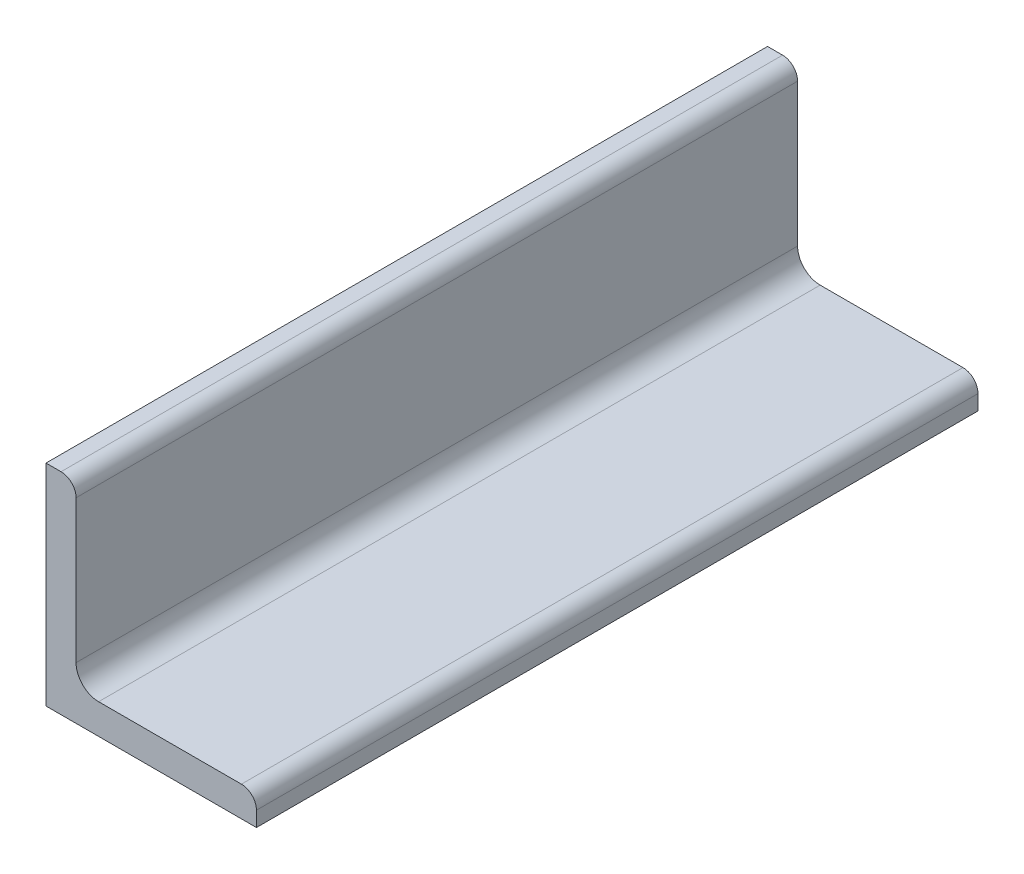
ISO-10303-21;
HEADER;
FILE_DESCRIPTION(('STEP AP214'),'2;1');
FILE_NAME('part.step','',(''),(''),'','','');
FILE_SCHEMA(('AUTOMOTIVE_DESIGN { 1 0 10303 214 1 1 1 1 }'));
ENDSEC;
DATA;
#1=APPLICATION_CONTEXT('core data for automotive mechanical design processes');
#2=APPLICATION_PROTOCOL_DEFINITION('international standard','automotive_design',2000,#1);
#3=PRODUCT_CONTEXT('',#1,'mechanical');
#4=PRODUCT('Part','Part','',(#3));
#5=PRODUCT_RELATED_PRODUCT_CATEGORY('part','',(#4));
#6=PRODUCT_DEFINITION_FORMATION('','',#4);
#7=PRODUCT_DEFINITION_CONTEXT('part definition',#1,'design');
#8=PRODUCT_DEFINITION('design','',#6,#7);
#9=PRODUCT_DEFINITION_SHAPE('','',#8);
#10=(LENGTH_UNIT() NAMED_UNIT(*) SI_UNIT(.MILLI.,.METRE.));
#11=(NAMED_UNIT(*) PLANE_ANGLE_UNIT() SI_UNIT($,.RADIAN.));
#12=(NAMED_UNIT(*) SI_UNIT($,.STERADIAN.) SOLID_ANGLE_UNIT());
#13=UNCERTAINTY_MEASURE_WITH_UNIT(LENGTH_MEASURE(1.E-05),#10,'distance_accuracy_value','');
#14=(GEOMETRIC_REPRESENTATION_CONTEXT(3) GLOBAL_UNCERTAINTY_ASSIGNED_CONTEXT((#13)) GLOBAL_UNIT_ASSIGNED_CONTEXT((#10,
#11,#12)) REPRESENTATION_CONTEXT('',''));
#15=CARTESIAN_POINT('',(0.,0.,0.));
#16=DIRECTION('',(0.,0.,1.));
#17=DIRECTION('',(1.,0.,0.));
#18=AXIS2_PLACEMENT_3D('',#15,#16,#17);
#19=CARTESIAN_POINT('',(0.0836264027816469,89.7372005393545,304.8));
#20=DIRECTION('',(1.,0.,0.));
#21=DIRECTION('',(0.,0.,-1.));
#22=AXIS2_PLACEMENT_3D('',#19,#20,#21);
#23=PLANE('',#22);
#24=DIRECTION('',(0.,-1.,0.));
#25=VECTOR('',#24,1.);
#26=CARTESIAN_POINT('',(0.0836264027816469,89.7372005393545,0.));
#27=LINE('',#26,#25);
#28=CARTESIAN_POINT('',(0.0836264027816469,89.7372005393545,0.));
#29=VERTEX_POINT('',#28);
#30=CARTESIAN_POINT('',(0.0836264027816469,0.837200539354535,0.));
#31=VERTEX_POINT('',#30);
#32=EDGE_CURVE('E135',#29,#31,#27,.T.);
#33=ORIENTED_EDGE('',*,*,#32,.T.);
#34=DIRECTION('',(0.,0.,-1.));
#35=VECTOR('',#34,1.);
#36=CARTESIAN_POINT('',(0.0836264027816469,0.837200539354535,304.8));
#37=LINE('',#36,#35);
#38=CARTESIAN_POINT('',(0.0836264027816469,0.837200539354535,304.8));
#39=VERTEX_POINT('',#38);
#40=EDGE_CURVE('E11',#39,#31,#37,.T.);
#41=ORIENTED_EDGE('',*,*,#40,.F.);
#42=DIRECTION('',(0.,-1.,0.));
#43=VECTOR('',#42,1.);
#44=CARTESIAN_POINT('',(0.0836264027816469,89.7372005393545,304.8));
#45=LINE('',#44,#43);
#46=CARTESIAN_POINT('',(0.0836264027816469,89.7372005393545,304.8));
#47=VERTEX_POINT('',#46);
#48=EDGE_CURVE('E151',#47,#39,#45,.T.);
#49=ORIENTED_EDGE('',*,*,#48,.F.);
#50=DIRECTION('',(0.,0.,-1.));
#51=VECTOR('',#50,1.);
#52=CARTESIAN_POINT('',(0.0836264027816469,89.7372005393545,304.8));
#53=LINE('',#52,#51);
#54=EDGE_CURVE('E131',#47,#29,#53,.T.);
#55=ORIENTED_EDGE('',*,*,#54,.T.);
#56=EDGE_LOOP('',(#33,#41,#49,#55));
#57=FACE_BOUND('',#56,.T.);
#58=ADVANCED_FACE('F33',(#57),#23,.F.);
#59=CARTESIAN_POINT('',(0.0836264027816469,0.837200539354535,304.8));
#60=DIRECTION('',(0.,1.,0.));
#61=DIRECTION('',(0.,0.,1.));
#62=AXIS2_PLACEMENT_3D('',#59,#60,#61);
#63=PLANE('',#62);
#64=DIRECTION('',(1.,0.,0.));
#65=VECTOR('',#64,1.);
#66=CARTESIAN_POINT('',(0.0836264027816469,0.837200539354535,0.));
#67=LINE('',#66,#65);
#68=CARTESIAN_POINT('',(88.9836264027817,0.837200539354535,0.));
#69=VERTEX_POINT('',#68);
#70=EDGE_CURVE('E138',#31,#69,#67,.T.);
#71=ORIENTED_EDGE('',*,*,#70,.T.);
#72=DIRECTION('',(0.,0.,-1.));
#73=VECTOR('',#72,1.);
#74=CARTESIAN_POINT('',(88.9836264027817,0.837200539354535,304.8));
#75=LINE('',#74,#73);
#76=CARTESIAN_POINT('',(88.9836264027817,0.837200539354535,304.8));
#77=VERTEX_POINT('',#76);
#78=EDGE_CURVE('E41',#77,#69,#75,.T.);
#79=ORIENTED_EDGE('',*,*,#78,.F.);
#80=DIRECTION('',(1.,0.,0.));
#81=VECTOR('',#80,1.);
#82=CARTESIAN_POINT('',(0.0836264027816469,0.837200539354535,304.8));
#83=LINE('',#82,#81);
#84=EDGE_CURVE('E95',#39,#77,#83,.T.);
#85=ORIENTED_EDGE('',*,*,#84,.F.);
#86=ORIENTED_EDGE('',*,*,#40,.T.);
#87=EDGE_LOOP('',(#71,#79,#85,#86));
#88=FACE_BOUND('',#87,.T.);
#89=ADVANCED_FACE('F194',(#88),#63,.F.);
#90=CARTESIAN_POINT('',(88.9836264027817,0.837200539354535,304.8));
#91=DIRECTION('',(-1.,0.,0.));
#92=DIRECTION('',(0.,0.,1.));
#93=AXIS2_PLACEMENT_3D('',#90,#91,#92);
#94=PLANE('',#93);
#95=DIRECTION('',(0.,1.,0.));
#96=VECTOR('',#95,1.);
#97=CARTESIAN_POINT('',(88.9836264027817,0.837200539354535,0.));
#98=LINE('',#97,#96);
#99=CARTESIAN_POINT('',(88.9836264027817,7.18720053935453,0.));
#100=VERTEX_POINT('',#99);
#101=EDGE_CURVE('E140',#69,#100,#98,.T.);
#102=ORIENTED_EDGE('',*,*,#101,.T.);
#103=DIRECTION('',(0.,0.,-1.));
#104=VECTOR('',#103,1.);
#105=CARTESIAN_POINT('',(88.9836264027817,7.18720053935453,304.8));
#106=LINE('',#105,#104);
#107=CARTESIAN_POINT('',(88.9836264027817,7.18720053935453,304.8));
#108=VERTEX_POINT('',#107);
#109=EDGE_CURVE('E161',#108,#100,#106,.T.);
#110=ORIENTED_EDGE('',*,*,#109,.F.);
#111=DIRECTION('',(0.,1.,0.));
#112=VECTOR('',#111,1.);
#113=CARTESIAN_POINT('',(88.9836264027817,0.837200539354535,304.8));
#114=LINE('',#113,#112);
#115=EDGE_CURVE('E169',#77,#108,#114,.T.);
#116=ORIENTED_EDGE('',*,*,#115,.F.);
#117=ORIENTED_EDGE('',*,*,#78,.T.);
#118=EDGE_LOOP('',(#102,#110,#116,#117));
#119=FACE_BOUND('',#118,.T.);
#120=ADVANCED_FACE('F167',(#119),#94,.F.);
#121=CARTESIAN_POINT('',(82.6336264027816,7.18720053935453,304.8));
#122=DIRECTION('',(0.,0.,-1.));
#123=DIRECTION('',(-1.,0.,0.));
#124=AXIS2_PLACEMENT_3D('',#121,#122,#123);
#125=CYLINDRICAL_SURFACE('',#124,6.35);
#126=CARTESIAN_POINT('',(82.6336264027816,7.18720053935453,0.));
#127=DIRECTION('',(0.,0.,1.));
#128=DIRECTION('',(1.,0.,0.));
#129=AXIS2_PLACEMENT_3D('',#126,#127,#128);
#130=CIRCLE('',#129,6.35);
#131=CARTESIAN_POINT('',(82.6336264027816,13.5372005393545,0.));
#132=VERTEX_POINT('',#131);
#133=EDGE_CURVE('E142',#100,#132,#130,.T.);
#134=ORIENTED_EDGE('',*,*,#133,.T.);
#135=DIRECTION('',(0.,0.,-1.));
#136=VECTOR('',#135,1.);
#137=CARTESIAN_POINT('',(82.6336264027816,13.5372005393545,304.8));
#138=LINE('',#137,#136);
#139=CARTESIAN_POINT('',(82.6336264027816,13.5372005393545,304.8));
#140=VERTEX_POINT('',#139);
#141=EDGE_CURVE('E158',#140,#132,#138,.T.);
#142=ORIENTED_EDGE('',*,*,#141,.F.);
#143=CARTESIAN_POINT('',(82.6336264027816,7.18720053935453,304.8));
#144=DIRECTION('',(0.,0.,1.));
#145=DIRECTION('',(1.,0.,0.));
#146=AXIS2_PLACEMENT_3D('',#143,#144,#145);
#147=CIRCLE('',#146,6.35);
#148=EDGE_CURVE('E185',#108,#140,#147,.T.);
#149=ORIENTED_EDGE('',*,*,#148,.F.);
#150=ORIENTED_EDGE('',*,*,#109,.T.);
#151=EDGE_LOOP('',(#134,#142,#149,#150));
#152=FACE_BOUND('',#151,.T.);
#153=ADVANCED_FACE('F178',(#152),#125,.T.);
#154=CARTESIAN_POINT('',(82.6336264027816,13.5372005393545,304.8));
#155=DIRECTION('',(0.,-1.,0.));
#156=DIRECTION('',(0.,0.,-1.));
#157=AXIS2_PLACEMENT_3D('',#154,#155,#156);
#158=PLANE('',#157);
#159=DIRECTION('',(-1.,0.,0.));
#160=VECTOR('',#159,1.);
#161=CARTESIAN_POINT('',(82.6336264027816,13.5372005393545,0.));
#162=LINE('',#161,#160);
#163=CARTESIAN_POINT('',(22.3086264027816,13.5372005393545,0.));
#164=VERTEX_POINT('',#163);
#165=EDGE_CURVE('E144',#132,#164,#162,.T.);
#166=ORIENTED_EDGE('',*,*,#165,.T.);
#167=DIRECTION('',(0.,0.,-1.));
#168=VECTOR('',#167,1.);
#169=CARTESIAN_POINT('',(22.3086264027816,13.5372005393545,304.8));
#170=LINE('',#169,#168);
#171=CARTESIAN_POINT('',(22.3086264027816,13.5372005393545,304.8));
#172=VERTEX_POINT('',#171);
#173=EDGE_CURVE('E155',#172,#164,#170,.T.);
#174=ORIENTED_EDGE('',*,*,#173,.F.);
#175=DIRECTION('',(-1.,0.,0.));
#176=VECTOR('',#175,1.);
#177=CARTESIAN_POINT('',(82.6336264027816,13.5372005393545,304.8));
#178=LINE('',#177,#176);
#179=EDGE_CURVE('E184',#140,#172,#178,.T.);
#180=ORIENTED_EDGE('',*,*,#179,.F.);
#181=ORIENTED_EDGE('',*,*,#141,.T.);
#182=EDGE_LOOP('',(#166,#174,#180,#181));
#183=FACE_BOUND('',#182,.T.);
#184=ADVANCED_FACE('F182',(#183),#158,.F.);
#185=CARTESIAN_POINT('',(22.3086264027816,23.0622005393545,304.8));
#186=DIRECTION('',(0.,0.,-1.));
#187=DIRECTION('',(-1.,0.,0.));
#188=AXIS2_PLACEMENT_3D('',#185,#186,#187);
#189=CYLINDRICAL_SURFACE('',#188,9.52499999999999);
#190=CARTESIAN_POINT('',(22.3086264027816,23.0622005393545,0.));
#191=DIRECTION('',(0.,0.,-1.));
#192=DIRECTION('',(1.,0.,0.));
#193=AXIS2_PLACEMENT_3D('',#190,#191,#192);
#194=CIRCLE('',#193,9.52499999999999);
#195=CARTESIAN_POINT('',(12.7836264027816,23.0622005393545,0.));
#196=VERTEX_POINT('',#195);
#197=EDGE_CURVE('E146',#164,#196,#194,.T.);
#198=ORIENTED_EDGE('',*,*,#197,.T.);
#199=DIRECTION('',(0.,0.,-1.));
#200=VECTOR('',#199,1.);
#201=CARTESIAN_POINT('',(12.7836264027816,23.0622005393545,304.8));
#202=LINE('',#201,#200);
#203=CARTESIAN_POINT('',(12.7836264027816,23.0622005393545,304.8));
#204=VERTEX_POINT('',#203);
#205=EDGE_CURVE('E126',#204,#196,#202,.T.);
#206=ORIENTED_EDGE('',*,*,#205,.F.);
#207=CARTESIAN_POINT('',(22.3086264027816,23.0622005393545,304.8));
#208=DIRECTION('',(0.,0.,-1.));
#209=DIRECTION('',(1.,0.,0.));
#210=AXIS2_PLACEMENT_3D('',#207,#208,#209);
#211=CIRCLE('',#210,9.52499999999999);
#212=EDGE_CURVE('E117',#172,#204,#211,.T.);
#213=ORIENTED_EDGE('',*,*,#212,.F.);
#214=ORIENTED_EDGE('',*,*,#173,.T.);
#215=EDGE_LOOP('',(#198,#206,#213,#214));
#216=FACE_BOUND('',#215,.T.);
#217=ADVANCED_FACE('F206',(#216),#189,.F.);
#218=CARTESIAN_POINT('',(12.7836264027816,23.0622005393545,304.8));
#219=DIRECTION('',(-1.,0.,0.));
#220=DIRECTION('',(0.,0.,1.));
#221=AXIS2_PLACEMENT_3D('',#218,#219,#220);
#222=PLANE('',#221);
#223=DIRECTION('',(0.,1.,0.));
#224=VECTOR('',#223,1.);
#225=CARTESIAN_POINT('',(12.7836264027816,23.0622005393545,0.));
#226=LINE('',#225,#224);
#227=CARTESIAN_POINT('',(12.7836264027816,83.3872005393545,0.));
#228=VERTEX_POINT('',#227);
#229=EDGE_CURVE('E125',#196,#228,#226,.T.);
#230=ORIENTED_EDGE('',*,*,#229,.T.);
#231=DIRECTION('',(0.,0.,-1.));
#232=VECTOR('',#231,1.);
#233=CARTESIAN_POINT('',(12.7836264027816,83.3872005393545,304.8));
#234=LINE('',#233,#232);
#235=CARTESIAN_POINT('',(12.7836264027816,83.3872005393545,304.8));
#236=VERTEX_POINT('',#235);
#237=EDGE_CURVE('E122',#236,#228,#234,.T.);
#238=ORIENTED_EDGE('',*,*,#237,.F.);
#239=DIRECTION('',(0.,1.,0.));
#240=VECTOR('',#239,1.);
#241=CARTESIAN_POINT('',(12.7836264027816,23.0622005393545,304.8));
#242=LINE('',#241,#240);
#243=EDGE_CURVE('E111',#204,#236,#242,.T.);
#244=ORIENTED_EDGE('',*,*,#243,.F.);
#245=ORIENTED_EDGE('',*,*,#205,.T.);
#246=EDGE_LOOP('',(#230,#238,#244,#245));
#247=FACE_BOUND('',#246,.T.);
#248=ADVANCED_FACE('F123',(#247),#222,.F.);
#249=CARTESIAN_POINT('',(6.43362640278164,83.3872005393545,304.8));
#250=DIRECTION('',(0.,0.,-1.));
#251=DIRECTION('',(-1.,0.,0.));
#252=AXIS2_PLACEMENT_3D('',#249,#250,#251);
#253=CYLINDRICAL_SURFACE('',#252,6.35);
#254=CARTESIAN_POINT('',(6.43362640278164,83.3872005393545,0.));
#255=DIRECTION('',(0.,0.,1.));
#256=DIRECTION('',(1.,0.,0.));
#257=AXIS2_PLACEMENT_3D('',#254,#255,#256);
#258=CIRCLE('',#257,6.35);
#259=CARTESIAN_POINT('',(6.43362640278165,89.7372005393545,0.));
#260=VERTEX_POINT('',#259);
#261=EDGE_CURVE('E81',#228,#260,#258,.T.);
#262=ORIENTED_EDGE('',*,*,#261,.T.);
#263=DIRECTION('',(0.,0.,-1.));
#264=VECTOR('',#263,1.);
#265=CARTESIAN_POINT('',(6.43362640278165,89.7372005393545,304.8));
#266=LINE('',#265,#264);
#267=CARTESIAN_POINT('',(6.43362640278165,89.7372005393545,304.8));
#268=VERTEX_POINT('',#267);
#269=EDGE_CURVE('E127',#268,#260,#266,.T.);
#270=ORIENTED_EDGE('',*,*,#269,.F.);
#271=CARTESIAN_POINT('',(6.43362640278164,83.3872005393545,304.8));
#272=DIRECTION('',(0.,0.,1.));
#273=DIRECTION('',(1.,0.,0.));
#274=AXIS2_PLACEMENT_3D('',#271,#272,#273);
#275=CIRCLE('',#274,6.35);
#276=EDGE_CURVE('E115',#236,#268,#275,.T.);
#277=ORIENTED_EDGE('',*,*,#276,.F.);
#278=ORIENTED_EDGE('',*,*,#237,.T.);
#279=EDGE_LOOP('',(#262,#270,#277,#278));
#280=FACE_BOUND('',#279,.T.);
#281=ADVANCED_FACE('F129',(#280),#253,.T.);
#282=CARTESIAN_POINT('',(6.43362640278165,89.7372005393545,304.8));
#283=DIRECTION('',(0.,-1.,0.));
#284=DIRECTION('',(0.,0.,-1.));
#285=AXIS2_PLACEMENT_3D('',#282,#283,#284);
#286=PLANE('',#285);
#287=DIRECTION('',(-1.,0.,0.));
#288=VECTOR('',#287,1.);
#289=CARTESIAN_POINT('',(6.43362640278165,89.7372005393545,0.));
#290=LINE('',#289,#288);
#291=EDGE_CURVE('E87',#260,#29,#290,.T.);
#292=ORIENTED_EDGE('',*,*,#291,.T.);
#293=ORIENTED_EDGE('',*,*,#54,.F.);
#294=DIRECTION('',(-1.,0.,0.));
#295=VECTOR('',#294,1.);
#296=CARTESIAN_POINT('',(6.43362640278165,89.7372005393545,304.8));
#297=LINE('',#296,#295);
#298=EDGE_CURVE('E49',#268,#47,#297,.T.);
#299=ORIENTED_EDGE('',*,*,#298,.F.);
#300=ORIENTED_EDGE('',*,*,#269,.T.);
#301=EDGE_LOOP('',(#292,#293,#299,#300));
#302=FACE_BOUND('',#301,.T.);
#303=ADVANCED_FACE('F214',(#302),#286,.F.);
#304=CARTESIAN_POINT('',(82.6336264027816,7.18720053935453,304.8));
#305=DIRECTION('',(0.,0.,1.));
#306=DIRECTION('',(1.,0.,0.));
#307=AXIS2_PLACEMENT_3D('',#304,#305,#306);
#308=PLANE('',#307);
#309=ORIENTED_EDGE('',*,*,#48,.T.);
#310=ORIENTED_EDGE('',*,*,#84,.T.);
#311=ORIENTED_EDGE('',*,*,#115,.T.);
#312=ORIENTED_EDGE('',*,*,#148,.T.);
#313=ORIENTED_EDGE('',*,*,#179,.T.);
#314=ORIENTED_EDGE('',*,*,#212,.T.);
#315=ORIENTED_EDGE('',*,*,#243,.T.);
#316=ORIENTED_EDGE('',*,*,#276,.T.);
#317=ORIENTED_EDGE('',*,*,#298,.T.);
#318=EDGE_LOOP('',(#309,#310,#311,#312,#313,#314,#315,#316,#317));
#319=FACE_BOUND('',#318,.T.);
#320=ADVANCED_FACE('F113',(#319),#308,.T.);
#321=CARTESIAN_POINT('',(82.6336264027816,7.18720053935453,0.));
#322=DIRECTION('',(0.,0.,1.));
#323=DIRECTION('',(1.,0.,0.));
#324=AXIS2_PLACEMENT_3D('',#321,#322,#323);
#325=PLANE('',#324);
#326=ORIENTED_EDGE('',*,*,#32,.F.);
#327=ORIENTED_EDGE('',*,*,#291,.F.);
#328=ORIENTED_EDGE('',*,*,#261,.F.);
#329=ORIENTED_EDGE('',*,*,#229,.F.);
#330=ORIENTED_EDGE('',*,*,#197,.F.);
#331=ORIENTED_EDGE('',*,*,#165,.F.);
#332=ORIENTED_EDGE('',*,*,#133,.F.);
#333=ORIENTED_EDGE('',*,*,#101,.F.);
#334=ORIENTED_EDGE('',*,*,#70,.F.);
#335=EDGE_LOOP('',(#326,#327,#328,#329,#330,#331,#332,#333,#334));
#336=FACE_BOUND('',#335,.T.);
#337=ADVANCED_FACE('F173',(#336),#325,.F.);
#338=CLOSED_SHELL('',(#58,#89,#120,#153,#184,#217,#248,#281,#303,#320,#337));
#339=MANIFOLD_SOLID_BREP('B2',#338);
#340=ADVANCED_BREP_SHAPE_REPRESENTATION('',(#18,#339),#14);
#341=SHAPE_DEFINITION_REPRESENTATION(#9,#340);
ENDSEC;
END-ISO-10303-21;
